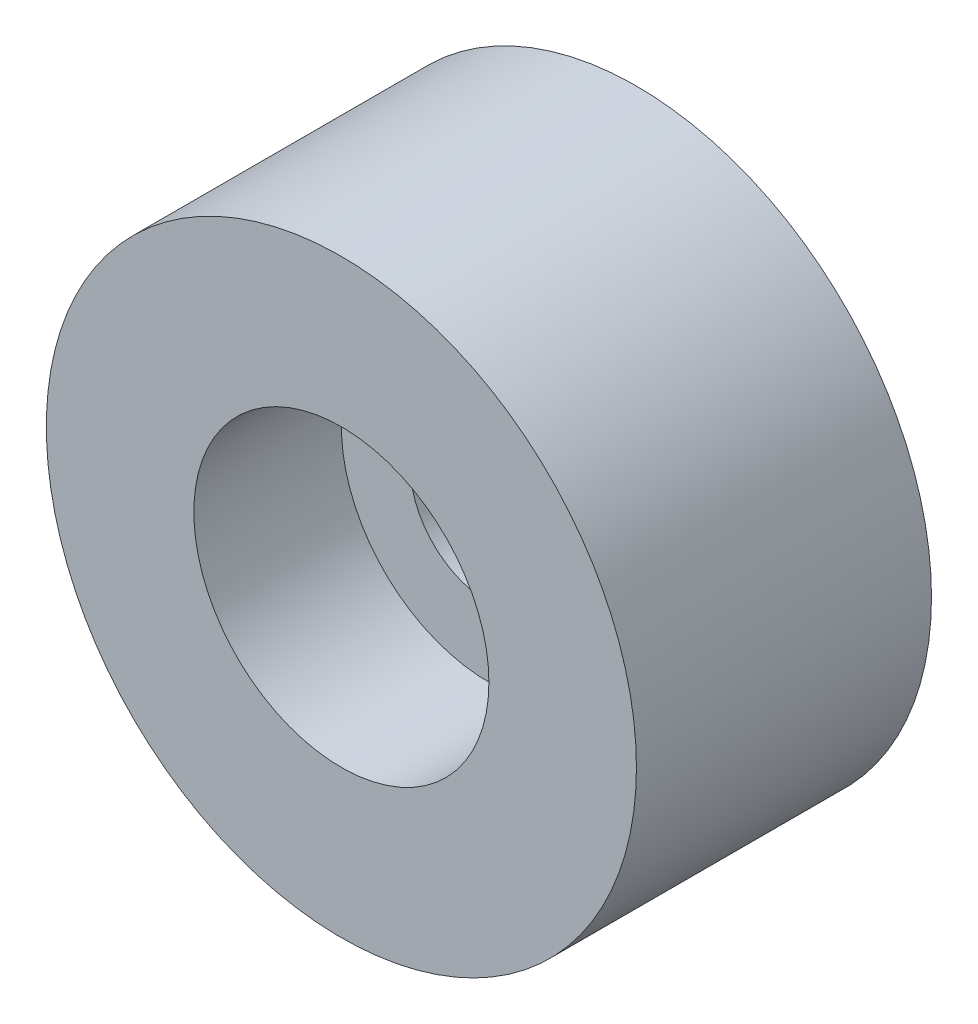
ISO-10303-21;
HEADER;
FILE_DESCRIPTION(('STEP AP214'),'2;1');
FILE_NAME('part.step','',(''),(''),'','','');
FILE_SCHEMA(('AUTOMOTIVE_DESIGN { 1 0 10303 214 1 1 1 1 }'));
ENDSEC;
DATA;
#1=APPLICATION_CONTEXT('core data for automotive mechanical design processes');
#2=APPLICATION_PROTOCOL_DEFINITION('international standard','automotive_design',2000,#1);
#3=PRODUCT_CONTEXT('',#1,'mechanical');
#4=PRODUCT('Part','Part','',(#3));
#5=PRODUCT_RELATED_PRODUCT_CATEGORY('part','',(#4));
#6=PRODUCT_DEFINITION_FORMATION('','',#4);
#7=PRODUCT_DEFINITION_CONTEXT('part definition',#1,'design');
#8=PRODUCT_DEFINITION('design','',#6,#7);
#9=PRODUCT_DEFINITION_SHAPE('','',#8);
#10=(LENGTH_UNIT() NAMED_UNIT(*) SI_UNIT(.MILLI.,.METRE.));
#11=(NAMED_UNIT(*) PLANE_ANGLE_UNIT() SI_UNIT($,.RADIAN.));
#12=(NAMED_UNIT(*) SI_UNIT($,.STERADIAN.) SOLID_ANGLE_UNIT());
#13=UNCERTAINTY_MEASURE_WITH_UNIT(LENGTH_MEASURE(1.E-05),#10,'distance_accuracy_value','');
#14=(GEOMETRIC_REPRESENTATION_CONTEXT(3) GLOBAL_UNCERTAINTY_ASSIGNED_CONTEXT((#13)) GLOBAL_UNIT_ASSIGNED_CONTEXT((#10,
#11,#12)) REPRESENTATION_CONTEXT('',''));
#15=CARTESIAN_POINT('',(0.,0.,0.));
#16=DIRECTION('',(0.,0.,1.));
#17=DIRECTION('',(1.,0.,0.));
#18=AXIS2_PLACEMENT_3D('',#15,#16,#17);
#19=CARTESIAN_POINT('',(0.,0.,-6.));
#20=DIRECTION('',(0.,0.,1.));
#21=DIRECTION('',(1.,0.,0.));
#22=AXIS2_PLACEMENT_3D('',#19,#20,#21);
#23=CYLINDRICAL_SURFACE('',#22,6.);
#24=CARTESIAN_POINT('',(0.,0.,-6.));
#25=DIRECTION('',(0.,0.,1.));
#26=DIRECTION('',(1.,0.,0.));
#27=AXIS2_PLACEMENT_3D('',#24,#25,#26);
#28=CIRCLE('',#27,6.);
#29=CARTESIAN_POINT('',(6.,0.,-6.));
#30=VERTEX_POINT('',#29);
#31=EDGE_CURVE('E10',#30,#30,#28,.T.);
#32=ORIENTED_EDGE('',*,*,#31,.T.);
#33=EDGE_LOOP('',(#32));
#34=FACE_BOUND('',#33,.T.);
#35=CARTESIAN_POINT('',(0.,0.,0.));
#36=DIRECTION('',(0.,0.,1.));
#37=DIRECTION('',(1.,0.,0.));
#38=AXIS2_PLACEMENT_3D('',#35,#36,#37);
#39=CIRCLE('',#38,6.);
#40=CARTESIAN_POINT('',(6.,0.,0.));
#41=VERTEX_POINT('',#40);
#42=EDGE_CURVE('E35',#41,#41,#39,.T.);
#43=ORIENTED_EDGE('',*,*,#42,.F.);
#44=EDGE_LOOP('',(#43));
#45=FACE_BOUND('',#44,.T.);
#46=ADVANCED_FACE('F32',(#34,#45),#23,.T.);
#47=CARTESIAN_POINT('',(0.,0.,-6.));
#48=DIRECTION('',(0.,0.,1.));
#49=DIRECTION('',(1.,0.,0.));
#50=AXIS2_PLACEMENT_3D('',#47,#48,#49);
#51=PLANE('',#50);
#52=CARTESIAN_POINT('',(0.,0.,-6.));
#53=DIRECTION('',(0.,0.,-1.));
#54=DIRECTION('',(-1.,0.,0.));
#55=AXIS2_PLACEMENT_3D('',#52,#53,#54);
#56=CIRCLE('',#55,1.6);
#57=CARTESIAN_POINT('',(-1.6,0.,-6.));
#58=VERTEX_POINT('',#57);
#59=EDGE_CURVE('E52',#58,#58,#56,.T.);
#60=ORIENTED_EDGE('',*,*,#59,.F.);
#61=EDGE_LOOP('',(#60));
#62=FACE_BOUND('',#61,.T.);
#63=ORIENTED_EDGE('',*,*,#31,.F.);
#64=EDGE_LOOP('',(#63));
#65=FACE_BOUND('',#64,.T.);
#66=ADVANCED_FACE('F58',(#62,#65),#51,.F.);
#67=CARTESIAN_POINT('',(0.,0.,0.));
#68=DIRECTION('',(0.,0.,1.));
#69=DIRECTION('',(1.,0.,0.));
#70=AXIS2_PLACEMENT_3D('',#67,#68,#69);
#71=PLANE('',#70);
#72=CARTESIAN_POINT('',(0.,0.,0.));
#73=DIRECTION('',(0.,0.,1.));
#74=DIRECTION('',(1.,0.,0.));
#75=AXIS2_PLACEMENT_3D('',#72,#73,#74);
#76=CIRCLE('',#75,3.);
#77=CARTESIAN_POINT('',(3.,0.,0.));
#78=VERTEX_POINT('',#77);
#79=EDGE_CURVE('E44',#78,#78,#76,.T.);
#80=ORIENTED_EDGE('',*,*,#79,.F.);
#81=EDGE_LOOP('',(#80));
#82=FACE_BOUND('',#81,.T.);
#83=ORIENTED_EDGE('',*,*,#42,.T.);
#84=EDGE_LOOP('',(#83));
#85=FACE_BOUND('',#84,.T.);
#86=ADVANCED_FACE('F61',(#82,#85),#71,.T.);
#87=CARTESIAN_POINT('',(0.,0.,-3.));
#88=DIRECTION('',(0.,0.,1.));
#89=DIRECTION('',(1.,0.,0.));
#90=AXIS2_PLACEMENT_3D('',#87,#88,#89);
#91=CYLINDRICAL_SURFACE('',#90,3.);
#92=CARTESIAN_POINT('',(0.,0.,-3.));
#93=DIRECTION('',(0.,0.,1.));
#94=DIRECTION('',(1.,0.,0.));
#95=AXIS2_PLACEMENT_3D('',#92,#93,#94);
#96=CIRCLE('',#95,3.);
#97=CARTESIAN_POINT('',(3.,0.,-3.));
#98=VERTEX_POINT('',#97);
#99=EDGE_CURVE('E42',#98,#98,#96,.T.);
#100=ORIENTED_EDGE('',*,*,#99,.F.);
#101=EDGE_LOOP('',(#100));
#102=FACE_BOUND('',#101,.T.);
#103=ORIENTED_EDGE('',*,*,#79,.T.);
#104=EDGE_LOOP('',(#103));
#105=FACE_BOUND('',#104,.T.);
#106=ADVANCED_FACE('F67',(#102,#105),#91,.F.);
#107=CARTESIAN_POINT('',(0.,0.,-3.));
#108=DIRECTION('',(0.,0.,1.));
#109=DIRECTION('',(1.,0.,0.));
#110=AXIS2_PLACEMENT_3D('',#107,#108,#109);
#111=PLANE('',#110);
#112=CARTESIAN_POINT('',(0.,0.,-3.));
#113=DIRECTION('',(0.,0.,1.));
#114=DIRECTION('',(1.,0.,0.));
#115=AXIS2_PLACEMENT_3D('',#112,#113,#114);
#116=CIRCLE('',#115,1.6);
#117=CARTESIAN_POINT('',(1.6,0.,-3.));
#118=VERTEX_POINT('',#117);
#119=EDGE_CURVE('E47',#118,#118,#116,.T.);
#120=ORIENTED_EDGE('',*,*,#119,.F.);
#121=EDGE_LOOP('',(#120));
#122=FACE_BOUND('',#121,.T.);
#123=ORIENTED_EDGE('',*,*,#99,.T.);
#124=EDGE_LOOP('',(#123));
#125=FACE_BOUND('',#124,.T.);
#126=ADVANCED_FACE('F72',(#122,#125),#111,.T.);
#127=CARTESIAN_POINT('',(0.,0.,-6.));
#128=DIRECTION('',(0.,0.,-1.));
#129=DIRECTION('',(-1.,0.,0.));
#130=AXIS2_PLACEMENT_3D('',#127,#128,#129);
#131=CYLINDRICAL_SURFACE('',#130,1.6);
#132=ORIENTED_EDGE('',*,*,#119,.T.);
#133=EDGE_LOOP('',(#132));
#134=FACE_BOUND('',#133,.T.);
#135=ORIENTED_EDGE('',*,*,#59,.T.);
#136=EDGE_LOOP('',(#135));
#137=FACE_BOUND('',#136,.T.);
#138=ADVANCED_FACE('F56',(#134,#137),#131,.F.);
#139=CLOSED_SHELL('',(#46,#66,#86,#106,#126,#138));
#140=MANIFOLD_SOLID_BREP('B2',#139);
#141=ADVANCED_BREP_SHAPE_REPRESENTATION('',(#18,#140),#14);
#142=SHAPE_DEFINITION_REPRESENTATION(#9,#141);
ENDSEC;
END-ISO-10303-21;
